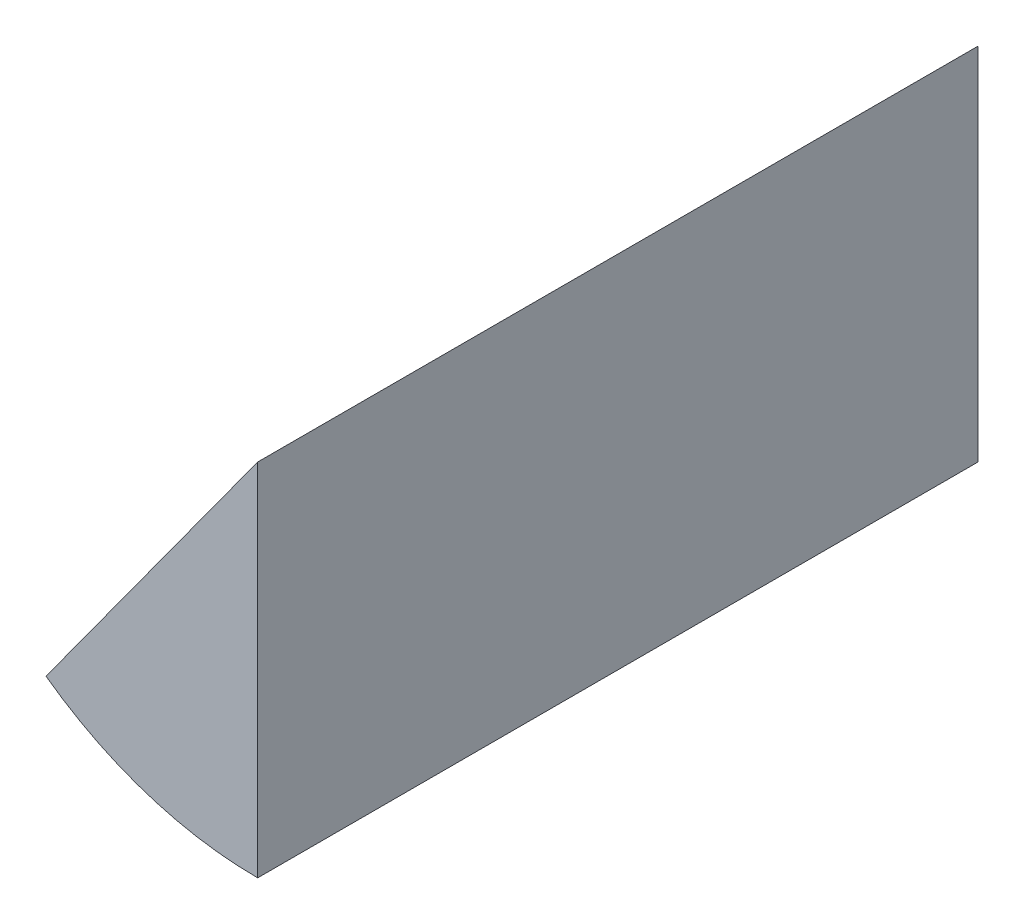
ISO-10303-21;
HEADER;
FILE_DESCRIPTION(('STEP AP214'),'2;1');
FILE_NAME('part.step','',(''),(''),'','','');
FILE_SCHEMA(('AUTOMOTIVE_DESIGN { 1 0 10303 214 1 1 1 1 }'));
ENDSEC;
DATA;
#1=APPLICATION_CONTEXT('core data for automotive mechanical design processes');
#2=APPLICATION_PROTOCOL_DEFINITION('international standard','automotive_design',2000,#1);
#3=PRODUCT_CONTEXT('',#1,'mechanical');
#4=PRODUCT('Part','Part','',(#3));
#5=PRODUCT_RELATED_PRODUCT_CATEGORY('part','',(#4));
#6=PRODUCT_DEFINITION_FORMATION('','',#4);
#7=PRODUCT_DEFINITION_CONTEXT('part definition',#1,'design');
#8=PRODUCT_DEFINITION('design','',#6,#7);
#9=PRODUCT_DEFINITION_SHAPE('','',#8);
#10=(LENGTH_UNIT() NAMED_UNIT(*) SI_UNIT(.MILLI.,.METRE.));
#11=(NAMED_UNIT(*) PLANE_ANGLE_UNIT() SI_UNIT($,.RADIAN.));
#12=(NAMED_UNIT(*) SI_UNIT($,.STERADIAN.) SOLID_ANGLE_UNIT());
#13=UNCERTAINTY_MEASURE_WITH_UNIT(LENGTH_MEASURE(1.E-05),#10,'distance_accuracy_value','');
#14=(GEOMETRIC_REPRESENTATION_CONTEXT(3) GLOBAL_UNCERTAINTY_ASSIGNED_CONTEXT((#13)) GLOBAL_UNIT_ASSIGNED_CONTEXT((#10,
#11,#12)) REPRESENTATION_CONTEXT('',''));
#15=CARTESIAN_POINT('',(0.,0.,0.));
#16=DIRECTION('',(0.,0.,1.));
#17=DIRECTION('',(1.,0.,0.));
#18=AXIS2_PLACEMENT_3D('',#15,#16,#17);
#19=CARTESIAN_POINT('',(0.,0.,50.));
#20=DIRECTION('',(0.809016994374947,-0.587785252292474,0.));
#21=DIRECTION('',(0.587785252292474,0.809016994374947,0.));
#22=AXIS2_PLACEMENT_3D('',#19,#20,#21);
#23=PLANE('',#22);
#24=DIRECTION('',(-0.587785252292474,-0.809016994374947,0.));
#25=VECTOR('',#24,1.);
#26=CARTESIAN_POINT('',(0.,0.,0.));
#27=LINE('',#26,#25);
#28=CARTESIAN_POINT('',(0.,0.,0.));
#29=VERTEX_POINT('',#28);
#30=CARTESIAN_POINT('',(-14.6946313073119,-20.2254248593737,0.));
#31=VERTEX_POINT('',#30);
#32=EDGE_CURVE('E80',#29,#31,#27,.T.);
#33=ORIENTED_EDGE('',*,*,#32,.T.);
#34=DIRECTION('',(0.,0.,-1.));
#35=VECTOR('',#34,1.);
#36=CARTESIAN_POINT('',(-14.6946313073119,-20.2254248593737,50.));
#37=LINE('',#36,#35);
#38=CARTESIAN_POINT('',(-14.6946313073119,-20.2254248593737,50.));
#39=VERTEX_POINT('',#38);
#40=EDGE_CURVE('E11',#39,#31,#37,.T.);
#41=ORIENTED_EDGE('',*,*,#40,.F.);
#42=DIRECTION('',(-0.587785252292474,-0.809016994374947,0.));
#43=VECTOR('',#42,1.);
#44=CARTESIAN_POINT('',(0.,0.,50.));
#45=LINE('',#44,#43);
#46=CARTESIAN_POINT('',(0.,0.,50.));
#47=VERTEX_POINT('',#46);
#48=EDGE_CURVE('E73',#47,#39,#45,.T.);
#49=ORIENTED_EDGE('',*,*,#48,.F.);
#50=DIRECTION('',(0.,0.,-1.));
#51=VECTOR('',#50,1.);
#52=CARTESIAN_POINT('',(0.,0.,50.));
#53=LINE('',#52,#51);
#54=EDGE_CURVE('E81',#47,#29,#53,.T.);
#55=ORIENTED_EDGE('',*,*,#54,.T.);
#56=EDGE_LOOP('',(#33,#41,#49,#55));
#57=FACE_BOUND('',#56,.T.);
#58=ADVANCED_FACE('F33',(#57),#23,.F.);
#59=CARTESIAN_POINT('',(0.,0.,50.));
#60=DIRECTION('',(0.,0.,-1.));
#61=DIRECTION('',(-1.,0.,0.));
#62=AXIS2_PLACEMENT_3D('',#59,#60,#61);
#63=CYLINDRICAL_SURFACE('',#62,25.);
#64=CARTESIAN_POINT('',(0.,0.,0.));
#65=DIRECTION('',(0.,0.,1.));
#66=DIRECTION('',(1.,0.,0.));
#67=AXIS2_PLACEMENT_3D('',#64,#65,#66);
#68=CIRCLE('',#67,25.);
#69=CARTESIAN_POINT('',(0.,-25.,0.));
#70=VERTEX_POINT('',#69);
#71=EDGE_CURVE('E61',#31,#70,#68,.T.);
#72=ORIENTED_EDGE('',*,*,#71,.T.);
#73=DIRECTION('',(0.,0.,-1.));
#74=VECTOR('',#73,1.);
#75=CARTESIAN_POINT('',(0.,-25.,50.));
#76=LINE('',#75,#74);
#77=CARTESIAN_POINT('',(0.,-25.,50.));
#78=VERTEX_POINT('',#77);
#79=EDGE_CURVE('E41',#78,#70,#76,.T.);
#80=ORIENTED_EDGE('',*,*,#79,.F.);
#81=CARTESIAN_POINT('',(0.,0.,50.));
#82=DIRECTION('',(0.,0.,1.));
#83=DIRECTION('',(1.,0.,0.));
#84=AXIS2_PLACEMENT_3D('',#81,#82,#83);
#85=CIRCLE('',#84,25.);
#86=EDGE_CURVE('E69',#39,#78,#85,.T.);
#87=ORIENTED_EDGE('',*,*,#86,.F.);
#88=ORIENTED_EDGE('',*,*,#40,.T.);
#89=EDGE_LOOP('',(#72,#80,#87,#88));
#90=FACE_BOUND('',#89,.T.);
#91=ADVANCED_FACE('F70',(#90),#63,.T.);
#92=CARTESIAN_POINT('',(0.,0.,50.));
#93=DIRECTION('',(-1.,0.,0.));
#94=DIRECTION('',(0.,0.,1.));
#95=AXIS2_PLACEMENT_3D('',#92,#93,#94);
#96=PLANE('',#95);
#97=DIRECTION('',(0.,1.,0.));
#98=VECTOR('',#97,1.);
#99=CARTESIAN_POINT('',(0.,0.,0.));
#100=LINE('',#99,#98);
#101=EDGE_CURVE('E66',#70,#29,#100,.T.);
#102=ORIENTED_EDGE('',*,*,#101,.T.);
#103=ORIENTED_EDGE('',*,*,#54,.F.);
#104=DIRECTION('',(0.,1.,0.));
#105=VECTOR('',#104,1.);
#106=CARTESIAN_POINT('',(0.,0.,50.));
#107=LINE('',#106,#105);
#108=EDGE_CURVE('E49',#78,#47,#107,.T.);
#109=ORIENTED_EDGE('',*,*,#108,.F.);
#110=ORIENTED_EDGE('',*,*,#79,.T.);
#111=EDGE_LOOP('',(#102,#103,#109,#110));
#112=FACE_BOUND('',#111,.T.);
#113=ADVANCED_FACE('F92',(#112),#96,.F.);
#114=CARTESIAN_POINT('',(0.,0.,50.));
#115=DIRECTION('',(0.,0.,1.));
#116=DIRECTION('',(1.,0.,0.));
#117=AXIS2_PLACEMENT_3D('',#114,#115,#116);
#118=PLANE('',#117);
#119=ORIENTED_EDGE('',*,*,#48,.T.);
#120=ORIENTED_EDGE('',*,*,#86,.T.);
#121=ORIENTED_EDGE('',*,*,#108,.T.);
#122=EDGE_LOOP('',(#119,#120,#121));
#123=FACE_BOUND('',#122,.T.);
#124=ADVANCED_FACE('F76',(#123),#118,.T.);
#125=CARTESIAN_POINT('',(0.,0.,0.));
#126=DIRECTION('',(0.,0.,1.));
#127=DIRECTION('',(1.,0.,0.));
#128=AXIS2_PLACEMENT_3D('',#125,#126,#127);
#129=PLANE('',#128);
#130=CARTESIAN_POINT('',(-6.05393448423964,-18.2631543284283,0.));
#131=DIRECTION('',(0.,0.,-1.));
#132=DIRECTION('',(-1.,0.,0.));
#133=AXIS2_PLACEMENT_3D('',#130,#131,#132);
#134=CIRCLE('',#133,5.0031734933207);
#135=CARTESIAN_POINT('',(-11.0571079775603,-18.2631543284283,0.));
#136=VERTEX_POINT('',#135);
#137=EDGE_CURVE('E87',#136,#136,#134,.T.);
#138=ORIENTED_EDGE('',*,*,#137,.F.);
#139=EDGE_LOOP('',(#138));
#140=FACE_BOUND('',#139,.T.);
#141=ORIENTED_EDGE('',*,*,#32,.F.);
#142=ORIENTED_EDGE('',*,*,#101,.F.);
#143=ORIENTED_EDGE('',*,*,#71,.F.);
#144=EDGE_LOOP('',(#141,#142,#143));
#145=FACE_BOUND('',#144,.T.);
#146=ADVANCED_FACE('F93',(#140,#145),#129,.F.);
#147=CARTESIAN_POINT('',(-6.05393448423964,-18.2631543284283,10.));
#148=DIRECTION('',(0.,0.,-1.));
#149=DIRECTION('',(-1.,0.,0.));
#150=AXIS2_PLACEMENT_3D('',#147,#148,#149);
#151=CYLINDRICAL_SURFACE('',#150,5.0031734933207);
#152=CARTESIAN_POINT('',(-6.05393448423964,-18.2631543284283,10.));
#153=DIRECTION('',(0.,0.,-1.));
#154=DIRECTION('',(-1.,0.,0.));
#155=AXIS2_PLACEMENT_3D('',#152,#153,#154);
#156=CIRCLE('',#155,5.0031734933207);
#157=CARTESIAN_POINT('',(-11.0571079775603,-18.2631543284283,10.));
#158=VERTEX_POINT('',#157);
#159=EDGE_CURVE('E83',#158,#158,#156,.T.);
#160=ORIENTED_EDGE('',*,*,#159,.F.);
#161=EDGE_LOOP('',(#160));
#162=FACE_BOUND('',#161,.T.);
#163=ORIENTED_EDGE('',*,*,#137,.T.);
#164=EDGE_LOOP('',(#163));
#165=FACE_BOUND('',#164,.T.);
#166=ADVANCED_FACE('F95',(#162,#165),#151,.F.);
#167=CARTESIAN_POINT('',(-6.05393448423964,-18.2631543284283,10.));
#168=DIRECTION('',(0.,0.,-1.));
#169=DIRECTION('',(-1.,0.,0.));
#170=AXIS2_PLACEMENT_3D('',#167,#168,#169);
#171=PLANE('',#170);
#172=ORIENTED_EDGE('',*,*,#159,.T.);
#173=EDGE_LOOP('',(#172));
#174=FACE_BOUND('',#173,.T.);
#175=ADVANCED_FACE('F102',(#174),#171,.T.);
#176=CLOSED_SHELL('',(#58,#91,#113,#124,#146,#166,#175));
#177=MANIFOLD_SOLID_BREP('B2',#176);
#178=ADVANCED_BREP_SHAPE_REPRESENTATION('',(#18,#177),#14);
#179=SHAPE_DEFINITION_REPRESENTATION(#9,#178);
ENDSEC;
END-ISO-10303-21;
